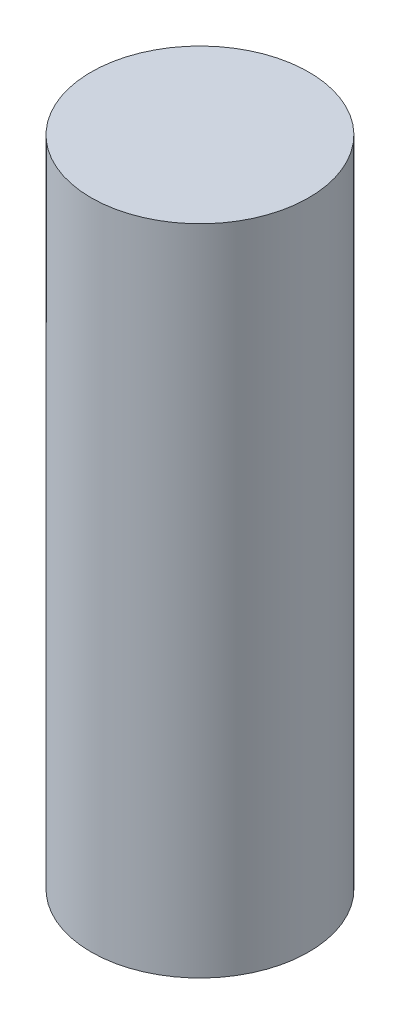
ISO-10303-21;
HEADER;
FILE_DESCRIPTION(('STEP AP214'),'2;1');
FILE_NAME('part.step','',(''),(''),'','','');
FILE_SCHEMA(('AUTOMOTIVE_DESIGN { 1 0 10303 214 1 1 1 1 }'));
ENDSEC;
DATA;
#1=APPLICATION_CONTEXT('core data for automotive mechanical design processes');
#2=APPLICATION_PROTOCOL_DEFINITION('international standard','automotive_design',2000,#1);
#3=PRODUCT_CONTEXT('',#1,'mechanical');
#4=PRODUCT('Part','Part','',(#3));
#5=PRODUCT_RELATED_PRODUCT_CATEGORY('part','',(#4));
#6=PRODUCT_DEFINITION_FORMATION('','',#4);
#7=PRODUCT_DEFINITION_CONTEXT('part definition',#1,'design');
#8=PRODUCT_DEFINITION('design','',#6,#7);
#9=PRODUCT_DEFINITION_SHAPE('','',#8);
#10=(LENGTH_UNIT() NAMED_UNIT(*) SI_UNIT(.MILLI.,.METRE.));
#11=(NAMED_UNIT(*) PLANE_ANGLE_UNIT() SI_UNIT($,.RADIAN.));
#12=(NAMED_UNIT(*) SI_UNIT($,.STERADIAN.) SOLID_ANGLE_UNIT());
#13=UNCERTAINTY_MEASURE_WITH_UNIT(LENGTH_MEASURE(1.E-05),#10,'distance_accuracy_value','');
#14=(GEOMETRIC_REPRESENTATION_CONTEXT(3) GLOBAL_UNCERTAINTY_ASSIGNED_CONTEXT((#13)) GLOBAL_UNIT_ASSIGNED_CONTEXT((#10,
#11,#12)) REPRESENTATION_CONTEXT('',''));
#15=CARTESIAN_POINT('',(0.,0.,0.));
#16=DIRECTION('',(0.,0.,1.));
#17=DIRECTION('',(1.,0.,0.));
#18=AXIS2_PLACEMENT_3D('',#15,#16,#17);
#19=CARTESIAN_POINT('',(0.,75.,0.));
#20=DIRECTION('',(0.,-1.,0.));
#21=DIRECTION('',(0.,0.,-1.));
#22=AXIS2_PLACEMENT_3D('',#19,#20,#21);
#23=CYLINDRICAL_SURFACE('',#22,12.5);
#24=CARTESIAN_POINT('',(0.,75.,0.));
#25=DIRECTION('',(0.,1.,0.));
#26=DIRECTION('',(0.,0.,1.));
#27=AXIS2_PLACEMENT_3D('',#24,#25,#26);
#28=CIRCLE('',#27,12.5);
#29=CARTESIAN_POINT('',(0.,75.,12.5));
#30=VERTEX_POINT('',#29);
#31=EDGE_CURVE('E10',#30,#30,#28,.T.);
#32=ORIENTED_EDGE('',*,*,#31,.F.);
#33=EDGE_LOOP('',(#32));
#34=FACE_BOUND('',#33,.T.);
#35=CARTESIAN_POINT('',(0.,0.,0.));
#36=DIRECTION('',(0.,1.,0.));
#37=DIRECTION('',(0.,0.,1.));
#38=AXIS2_PLACEMENT_3D('',#35,#36,#37);
#39=CIRCLE('',#38,12.5);
#40=CARTESIAN_POINT('',(0.,0.,12.5));
#41=VERTEX_POINT('',#40);
#42=EDGE_CURVE('E36',#41,#41,#39,.T.);
#43=ORIENTED_EDGE('',*,*,#42,.T.);
#44=EDGE_LOOP('',(#43));
#45=FACE_BOUND('',#44,.T.);
#46=ADVANCED_FACE('F33',(#34,#45),#23,.T.);
#47=CARTESIAN_POINT('',(0.,75.,0.));
#48=DIRECTION('',(0.,1.,0.));
#49=DIRECTION('',(0.,0.,1.));
#50=AXIS2_PLACEMENT_3D('',#47,#48,#49);
#51=PLANE('',#50);
#52=ORIENTED_EDGE('',*,*,#31,.T.);
#53=EDGE_LOOP('',(#52));
#54=FACE_BOUND('',#53,.T.);
#55=ADVANCED_FACE('F48',(#54),#51,.T.);
#56=CARTESIAN_POINT('',(0.,0.,0.));
#57=DIRECTION('',(0.,1.,0.));
#58=DIRECTION('',(0.,0.,1.));
#59=AXIS2_PLACEMENT_3D('',#56,#57,#58);
#60=PLANE('',#59);
#61=ORIENTED_EDGE('',*,*,#42,.F.);
#62=EDGE_LOOP('',(#61));
#63=FACE_BOUND('',#62,.T.);
#64=ADVANCED_FACE('F46',(#63),#60,.F.);
#65=CLOSED_SHELL('',(#46,#55,#64));
#66=MANIFOLD_SOLID_BREP('B2',#65);
#67=ADVANCED_BREP_SHAPE_REPRESENTATION('',(#18,#66),#14);
#68=SHAPE_DEFINITION_REPRESENTATION(#9,#67);
ENDSEC;
END-ISO-10303-21;
